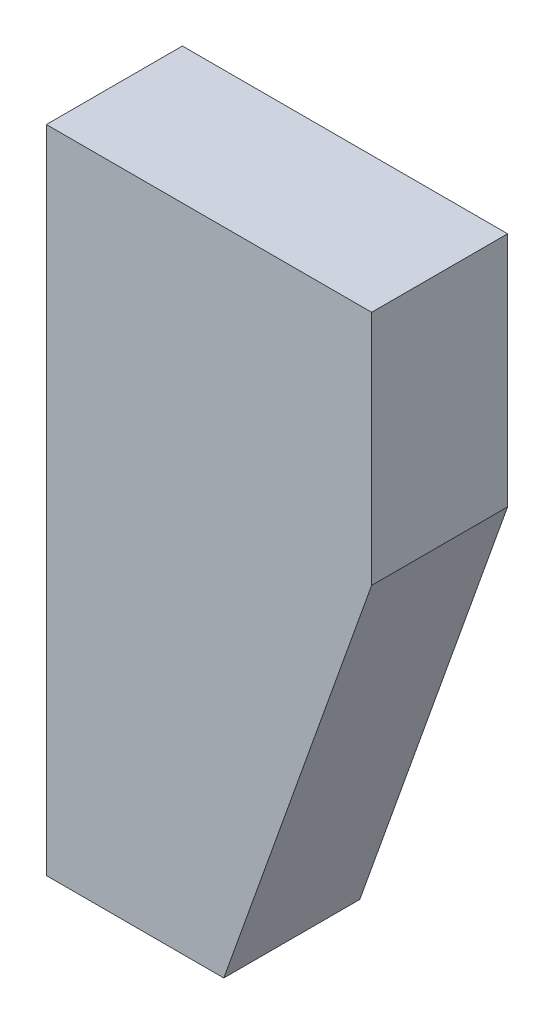
ISO-10303-21;
HEADER;
FILE_DESCRIPTION(('STEP AP214'),'2;1');
FILE_NAME('part.step','',(''),(''),'','','');
FILE_SCHEMA(('AUTOMOTIVE_DESIGN { 1 0 10303 214 1 1 1 1 }'));
ENDSEC;
DATA;
#1=APPLICATION_CONTEXT('core data for automotive mechanical design processes');
#2=APPLICATION_PROTOCOL_DEFINITION('international standard','automotive_design',2000,#1);
#3=PRODUCT_CONTEXT('',#1,'mechanical');
#4=PRODUCT('Part','Part','',(#3));
#5=PRODUCT_RELATED_PRODUCT_CATEGORY('part','',(#4));
#6=PRODUCT_DEFINITION_FORMATION('','',#4);
#7=PRODUCT_DEFINITION_CONTEXT('part definition',#1,'design');
#8=PRODUCT_DEFINITION('design','',#6,#7);
#9=PRODUCT_DEFINITION_SHAPE('','',#8);
#10=(LENGTH_UNIT() NAMED_UNIT(*) SI_UNIT(.MILLI.,.METRE.));
#11=(NAMED_UNIT(*) PLANE_ANGLE_UNIT() SI_UNIT($,.RADIAN.));
#12=(NAMED_UNIT(*) SI_UNIT($,.STERADIAN.) SOLID_ANGLE_UNIT());
#13=UNCERTAINTY_MEASURE_WITH_UNIT(LENGTH_MEASURE(1.E-05),#10,'distance_accuracy_value','');
#14=(GEOMETRIC_REPRESENTATION_CONTEXT(3) GLOBAL_UNCERTAINTY_ASSIGNED_CONTEXT((#13)) GLOBAL_UNIT_ASSIGNED_CONTEXT((#10,
#11,#12)) REPRESENTATION_CONTEXT('',''));
#15=CARTESIAN_POINT('',(0.,0.,0.));
#16=DIRECTION('',(0.,0.,1.));
#17=DIRECTION('',(1.,0.,0.));
#18=AXIS2_PLACEMENT_3D('',#15,#16,#17);
#19=CARTESIAN_POINT('',(0.,0.,2.3));
#20=DIRECTION('',(1.,0.,0.));
#21=DIRECTION('',(0.,0.,-1.));
#22=AXIS2_PLACEMENT_3D('',#19,#20,#21);
#23=PLANE('',#22);
#24=DIRECTION('',(0.,-1.,0.));
#25=VECTOR('',#24,1.);
#26=CARTESIAN_POINT('',(0.,0.,0.));
#27=LINE('',#26,#25);
#28=CARTESIAN_POINT('',(0.,11.,0.));
#29=VERTEX_POINT('',#28);
#30=CARTESIAN_POINT('',(0.,0.,0.));
#31=VERTEX_POINT('',#30);
#32=EDGE_CURVE('E91',#29,#31,#27,.T.);
#33=ORIENTED_EDGE('',*,*,#32,.T.);
#34=DIRECTION('',(0.,0.,-1.));
#35=VECTOR('',#34,1.);
#36=CARTESIAN_POINT('',(0.,0.,2.3));
#37=LINE('',#36,#35);
#38=CARTESIAN_POINT('',(0.,0.,2.3));
#39=VERTEX_POINT('',#38);
#40=EDGE_CURVE('E11',#39,#31,#37,.T.);
#41=ORIENTED_EDGE('',*,*,#40,.F.);
#42=DIRECTION('',(0.,-1.,0.));
#43=VECTOR('',#42,1.);
#44=CARTESIAN_POINT('',(0.,0.,2.3));
#45=LINE('',#44,#43);
#46=CARTESIAN_POINT('',(0.,11.,2.3));
#47=VERTEX_POINT('',#46);
#48=EDGE_CURVE('E99',#47,#39,#45,.T.);
#49=ORIENTED_EDGE('',*,*,#48,.F.);
#50=DIRECTION('',(0.,0.,-1.));
#51=VECTOR('',#50,1.);
#52=CARTESIAN_POINT('',(0.,11.,2.3));
#53=LINE('',#52,#51);
#54=EDGE_CURVE('E87',#47,#29,#53,.T.);
#55=ORIENTED_EDGE('',*,*,#54,.T.);
#56=EDGE_LOOP('',(#33,#41,#49,#55));
#57=FACE_BOUND('',#56,.T.);
#58=ADVANCED_FACE('F17',(#57),#23,.F.);
#59=CARTESIAN_POINT('',(0.,0.,2.3));
#60=DIRECTION('',(0.,1.,0.));
#61=DIRECTION('',(0.,0.,1.));
#62=AXIS2_PLACEMENT_3D('',#59,#60,#61);
#63=PLANE('',#62);
#64=DIRECTION('',(1.,0.,0.));
#65=VECTOR('',#64,1.);
#66=CARTESIAN_POINT('',(0.,0.,0.));
#67=LINE('',#66,#65);
#68=CARTESIAN_POINT('',(3.,0.,0.));
#69=VERTEX_POINT('',#68);
#70=EDGE_CURVE('E94',#31,#69,#67,.T.);
#71=ORIENTED_EDGE('',*,*,#70,.T.);
#72=DIRECTION('',(0.,0.,-1.));
#73=VECTOR('',#72,1.);
#74=CARTESIAN_POINT('',(3.,0.,2.3));
#75=LINE('',#74,#73);
#76=CARTESIAN_POINT('',(3.,0.,2.3));
#77=VERTEX_POINT('',#76);
#78=EDGE_CURVE('E25',#77,#69,#75,.T.);
#79=ORIENTED_EDGE('',*,*,#78,.F.);
#80=DIRECTION('',(1.,0.,0.));
#81=VECTOR('',#80,1.);
#82=CARTESIAN_POINT('',(0.,0.,2.3));
#83=LINE('',#82,#81);
#84=EDGE_CURVE('E67',#39,#77,#83,.T.);
#85=ORIENTED_EDGE('',*,*,#84,.F.);
#86=ORIENTED_EDGE('',*,*,#40,.T.);
#87=EDGE_LOOP('',(#71,#79,#85,#86));
#88=FACE_BOUND('',#87,.T.);
#89=ADVANCED_FACE('F120',(#88),#63,.F.);
#90=CARTESIAN_POINT('',(3.,0.,2.3));
#91=DIRECTION('',(-0.941741911594837,0.336336396998156,0.));
#92=DIRECTION('',(-0.336336396998156,-0.941741911594837,0.));
#93=AXIS2_PLACEMENT_3D('',#90,#91,#92);
#94=PLANE('',#93);
#95=DIRECTION('',(0.336336396998156,0.941741911594837,0.));
#96=VECTOR('',#95,1.);
#97=CARTESIAN_POINT('',(3.,0.,0.));
#98=LINE('',#97,#96);
#99=CARTESIAN_POINT('',(5.5,7.,0.));
#100=VERTEX_POINT('',#99);
#101=EDGE_CURVE('E82',#69,#100,#98,.T.);
#102=ORIENTED_EDGE('',*,*,#101,.T.);
#103=DIRECTION('',(0.,0.,-1.));
#104=VECTOR('',#103,1.);
#105=CARTESIAN_POINT('',(5.5,7.,2.3));
#106=LINE('',#105,#104);
#107=CARTESIAN_POINT('',(5.5,7.,2.3));
#108=VERTEX_POINT('',#107);
#109=EDGE_CURVE('E79',#108,#100,#106,.T.);
#110=ORIENTED_EDGE('',*,*,#109,.F.);
#111=DIRECTION('',(0.336336396998156,0.941741911594837,0.));
#112=VECTOR('',#111,1.);
#113=CARTESIAN_POINT('',(3.,0.,2.3));
#114=LINE('',#113,#112);
#115=EDGE_CURVE('E71',#77,#108,#114,.T.);
#116=ORIENTED_EDGE('',*,*,#115,.F.);
#117=ORIENTED_EDGE('',*,*,#78,.T.);
#118=EDGE_LOOP('',(#102,#110,#116,#117));
#119=FACE_BOUND('',#118,.T.);
#120=ADVANCED_FACE('F80',(#119),#94,.F.);
#121=CARTESIAN_POINT('',(5.5,7.,2.3));
#122=DIRECTION('',(-1.,0.,0.));
#123=DIRECTION('',(0.,0.,1.));
#124=AXIS2_PLACEMENT_3D('',#121,#122,#123);
#125=PLANE('',#124);
#126=DIRECTION('',(0.,1.,0.));
#127=VECTOR('',#126,1.);
#128=CARTESIAN_POINT('',(5.5,7.,0.));
#129=LINE('',#128,#127);
#130=CARTESIAN_POINT('',(5.5,11.,0.));
#131=VERTEX_POINT('',#130);
#132=EDGE_CURVE('E53',#100,#131,#129,.T.);
#133=ORIENTED_EDGE('',*,*,#132,.T.);
#134=DIRECTION('',(0.,0.,-1.));
#135=VECTOR('',#134,1.);
#136=CARTESIAN_POINT('',(5.5,11.,2.3));
#137=LINE('',#136,#135);
#138=CARTESIAN_POINT('',(5.5,11.,2.3));
#139=VERTEX_POINT('',#138);
#140=EDGE_CURVE('E83',#139,#131,#137,.T.);
#141=ORIENTED_EDGE('',*,*,#140,.F.);
#142=DIRECTION('',(0.,1.,0.));
#143=VECTOR('',#142,1.);
#144=CARTESIAN_POINT('',(5.5,7.,2.3));
#145=LINE('',#144,#143);
#146=EDGE_CURVE('E75',#108,#139,#145,.T.);
#147=ORIENTED_EDGE('',*,*,#146,.F.);
#148=ORIENTED_EDGE('',*,*,#109,.T.);
#149=EDGE_LOOP('',(#133,#141,#147,#148));
#150=FACE_BOUND('',#149,.T.);
#151=ADVANCED_FACE('F85',(#150),#125,.F.);
#152=CARTESIAN_POINT('',(0.,11.,2.3));
#153=DIRECTION('',(0.,-1.,0.));
#154=DIRECTION('',(0.,0.,-1.));
#155=AXIS2_PLACEMENT_3D('',#152,#153,#154);
#156=PLANE('',#155);
#157=DIRECTION('',(-1.,0.,0.));
#158=VECTOR('',#157,1.);
#159=CARTESIAN_POINT('',(0.,11.,0.));
#160=LINE('',#159,#158);
#161=EDGE_CURVE('E59',#131,#29,#160,.T.);
#162=ORIENTED_EDGE('',*,*,#161,.T.);
#163=ORIENTED_EDGE('',*,*,#54,.F.);
#164=DIRECTION('',(-1.,0.,0.));
#165=VECTOR('',#164,1.);
#166=CARTESIAN_POINT('',(0.,11.,2.3));
#167=LINE('',#166,#165);
#168=EDGE_CURVE('E33',#139,#47,#167,.T.);
#169=ORIENTED_EDGE('',*,*,#168,.F.);
#170=ORIENTED_EDGE('',*,*,#140,.T.);
#171=EDGE_LOOP('',(#162,#163,#169,#170));
#172=FACE_BOUND('',#171,.T.);
#173=ADVANCED_FACE('F107',(#172),#156,.F.);
#174=CARTESIAN_POINT('',(0.,0.,2.3));
#175=DIRECTION('',(0.,0.,-1.));
#176=DIRECTION('',(-1.,0.,0.));
#177=AXIS2_PLACEMENT_3D('',#174,#175,#176);
#178=PLANE('',#177);
#179=ORIENTED_EDGE('',*,*,#48,.T.);
#180=ORIENTED_EDGE('',*,*,#84,.T.);
#181=ORIENTED_EDGE('',*,*,#115,.T.);
#182=ORIENTED_EDGE('',*,*,#146,.T.);
#183=ORIENTED_EDGE('',*,*,#168,.T.);
#184=EDGE_LOOP('',(#179,#180,#181,#182,#183));
#185=FACE_BOUND('',#184,.T.);
#186=ADVANCED_FACE('F73',(#185),#178,.F.);
#187=CARTESIAN_POINT('',(0.,0.,0.));
#188=DIRECTION('',(0.,0.,-1.));
#189=DIRECTION('',(-1.,0.,0.));
#190=AXIS2_PLACEMENT_3D('',#187,#188,#189);
#191=PLANE('',#190);
#192=ORIENTED_EDGE('',*,*,#32,.F.);
#193=ORIENTED_EDGE('',*,*,#161,.F.);
#194=ORIENTED_EDGE('',*,*,#132,.F.);
#195=ORIENTED_EDGE('',*,*,#101,.F.);
#196=ORIENTED_EDGE('',*,*,#70,.F.);
#197=EDGE_LOOP('',(#192,#193,#194,#195,#196));
#198=FACE_BOUND('',#197,.T.);
#199=ADVANCED_FACE('F103',(#198),#191,.T.);
#200=CLOSED_SHELL('',(#58,#89,#120,#151,#173,#186,#199));
#201=MANIFOLD_SOLID_BREP('B1',#200);
#202=ADVANCED_BREP_SHAPE_REPRESENTATION('',(#18,#201),#14);
#203=SHAPE_DEFINITION_REPRESENTATION(#9,#202);
ENDSEC;
END-ISO-10303-21;
